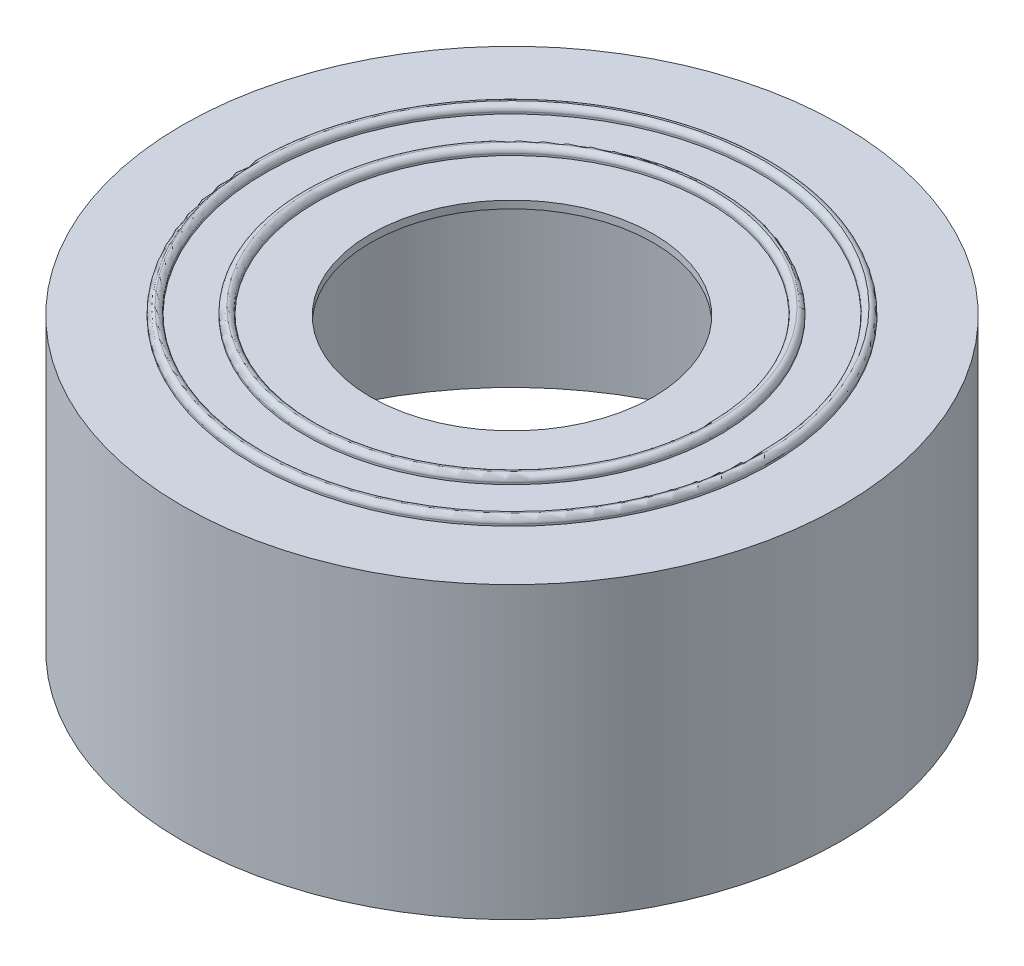
ISO-10303-21;
HEADER;
FILE_DESCRIPTION(('STEP AP214'),'2;1');
FILE_NAME('part.step','',(''),(''),'','','');
FILE_SCHEMA(('AUTOMOTIVE_DESIGN { 1 0 10303 214 1 1 1 1 }'));
ENDSEC;
DATA;
#1=APPLICATION_CONTEXT('core data for automotive mechanical design processes');
#2=APPLICATION_PROTOCOL_DEFINITION('international standard','automotive_design',2000,#1);
#3=PRODUCT_CONTEXT('',#1,'mechanical');
#4=PRODUCT('Part','Part','',(#3));
#5=PRODUCT_RELATED_PRODUCT_CATEGORY('part','',(#4));
#6=PRODUCT_DEFINITION_FORMATION('','',#4);
#7=PRODUCT_DEFINITION_CONTEXT('part definition',#1,'design');
#8=PRODUCT_DEFINITION('design','',#6,#7);
#9=PRODUCT_DEFINITION_SHAPE('','',#8);
#10=(LENGTH_UNIT() NAMED_UNIT(*) SI_UNIT(.MILLI.,.METRE.));
#11=(NAMED_UNIT(*) PLANE_ANGLE_UNIT() SI_UNIT($,.RADIAN.));
#12=(NAMED_UNIT(*) SI_UNIT($,.STERADIAN.) SOLID_ANGLE_UNIT());
#13=UNCERTAINTY_MEASURE_WITH_UNIT(LENGTH_MEASURE(1.E-05),#10,'distance_accuracy_value','');
#14=(GEOMETRIC_REPRESENTATION_CONTEXT(3) GLOBAL_UNCERTAINTY_ASSIGNED_CONTEXT((#13)) GLOBAL_UNIT_ASSIGNED_CONTEXT((#10,
#11,#12)) REPRESENTATION_CONTEXT('',''));
#15=CARTESIAN_POINT('',(0.,0.,0.));
#16=DIRECTION('',(0.,0.,1.));
#17=DIRECTION('',(1.,0.,0.));
#18=AXIS2_PLACEMENT_3D('',#15,#16,#17);
#19=CARTESIAN_POINT('',(0.,-2.,0.));
#20=DIRECTION('',(0.,-1.,0.));
#21=DIRECTION('',(0.,0.,-1.));
#22=AXIS2_PLACEMENT_3D('',#19,#20,#21);
#23=PLANE('',#22);
#24=CARTESIAN_POINT('',(0.,-2.,0.));
#25=DIRECTION('',(0.,-1.,0.));
#26=DIRECTION('',(0.,0.,-1.));
#27=AXIS2_PLACEMENT_3D('',#24,#25,#26);
#28=CIRCLE('',#27,37.5);
#29=CARTESIAN_POINT('',(0.,-2.,-37.5));
#30=VERTEX_POINT('',#29);
#31=EDGE_CURVE('E142',#30,#30,#28,.T.);
#32=ORIENTED_EDGE('',*,*,#31,.F.);
#33=EDGE_LOOP('',(#32));
#34=FACE_BOUND('',#33,.T.);
#35=CARTESIAN_POINT('',(0.,-2.,0.));
#36=DIRECTION('',(0.,-1.,0.));
#37=DIRECTION('',(0.,0.,-1.));
#38=AXIS2_PLACEMENT_3D('',#35,#36,#37);
#39=CIRCLE('',#38,85.5);
#40=CARTESIAN_POINT('',(0.,-2.,-85.5));
#41=VERTEX_POINT('',#40);
#42=EDGE_CURVE('E125',#41,#41,#39,.F.);
#43=ORIENTED_EDGE('',*,*,#42,.F.);
#44=EDGE_LOOP('',(#43));
#45=FACE_BOUND('',#44,.T.);
#46=ADVANCED_FACE('F41',(#34,#45),#23,.T.);
#47=CARTESIAN_POINT('',(0.,0.,0.));
#48=DIRECTION('',(0.,-1.,0.));
#49=DIRECTION('',(0.,0.,-1.));
#50=AXIS2_PLACEMENT_3D('',#47,#48,#49);
#51=PLANE('',#50);
#52=CARTESIAN_POINT('',(0.,0.,0.));
#53=DIRECTION('',(0.,-1.,0.));
#54=DIRECTION('',(0.,0.,-1.));
#55=AXIS2_PLACEMENT_3D('',#52,#53,#54);
#56=CIRCLE('',#55,37.5);
#57=CARTESIAN_POINT('',(0.,0.,-37.5));
#58=VERTEX_POINT('',#57);
#59=EDGE_CURVE('E143',#58,#58,#56,.T.);
#60=ORIENTED_EDGE('',*,*,#59,.T.);
#61=EDGE_LOOP('',(#60));
#62=FACE_BOUND('',#61,.T.);
#63=CARTESIAN_POINT('',(0.,0.,0.));
#64=DIRECTION('',(0.,1.,0.));
#65=DIRECTION('',(0.,0.,1.));
#66=AXIS2_PLACEMENT_3D('',#63,#64,#65);
#67=CIRCLE('',#66,52.);
#68=CARTESIAN_POINT('',(0.,0.,52.));
#69=VERTEX_POINT('',#68);
#70=EDGE_CURVE('E146',#69,#69,#67,.T.);
#71=ORIENTED_EDGE('',*,*,#70,.T.);
#72=EDGE_LOOP('',(#71));
#73=FACE_BOUND('',#72,.T.);
#74=ADVANCED_FACE('F81',(#62,#73),#51,.F.);
#75=CARTESIAN_POINT('',(0.,2.,0.));
#76=DIRECTION('',(0.,-1.,0.));
#77=DIRECTION('',(0.,0.,-1.));
#78=AXIS2_PLACEMENT_3D('',#75,#76,#77);
#79=CYLINDRICAL_SURFACE('',#78,65.5);
#80=CARTESIAN_POINT('',(0.,0.5,0.));
#81=DIRECTION('',(0.,1.,0.));
#82=DIRECTION('',(0.,0.,1.));
#83=AXIS2_PLACEMENT_3D('',#80,#81,#82);
#84=CIRCLE('',#83,65.5);
#85=CARTESIAN_POINT('',(0.,0.5,65.5));
#86=VERTEX_POINT('',#85);
#87=EDGE_CURVE('E49',#86,#86,#84,.T.);
#88=ORIENTED_EDGE('',*,*,#87,.T.);
#89=EDGE_LOOP('',(#88));
#90=FACE_BOUND('',#89,.T.);
#91=CARTESIAN_POINT('',(0.,0.,0.));
#92=DIRECTION('',(0.,1.,0.));
#93=DIRECTION('',(0.,0.,1.));
#94=AXIS2_PLACEMENT_3D('',#91,#92,#93);
#95=CIRCLE('',#94,65.5);
#96=CARTESIAN_POINT('',(0.,0.,65.5));
#97=VERTEX_POINT('',#96);
#98=EDGE_CURVE('E133',#97,#97,#95,.T.);
#99=ORIENTED_EDGE('',*,*,#98,.F.);
#100=EDGE_LOOP('',(#99));
#101=FACE_BOUND('',#100,.T.);
#102=ADVANCED_FACE('F87',(#90,#101),#79,.F.);
#103=CARTESIAN_POINT('',(0.,2.,0.));
#104=DIRECTION('',(0.,-1.,0.));
#105=DIRECTION('',(0.,0.,-1.));
#106=AXIS2_PLACEMENT_3D('',#103,#104,#105);
#107=CYLINDRICAL_SURFACE('',#106,68.5);
#108=CARTESIAN_POINT('',(0.,0.5,0.));
#109=DIRECTION('',(0.,1.,0.));
#110=DIRECTION('',(0.,0.,1.));
#111=AXIS2_PLACEMENT_3D('',#108,#109,#110);
#112=CIRCLE('',#111,68.5);
#113=CARTESIAN_POINT('',(0.,0.5,68.5));
#114=VERTEX_POINT('',#113);
#115=EDGE_CURVE('E11',#114,#114,#112,.F.);
#116=ORIENTED_EDGE('',*,*,#115,.T.);
#117=EDGE_LOOP('',(#116));
#118=FACE_BOUND('',#117,.T.);
#119=CARTESIAN_POINT('',(0.,0.,0.));
#120=DIRECTION('',(0.,1.,0.));
#121=DIRECTION('',(0.,0.,1.));
#122=AXIS2_PLACEMENT_3D('',#119,#120,#121);
#123=CIRCLE('',#122,68.5);
#124=CARTESIAN_POINT('',(0.,0.,68.5));
#125=VERTEX_POINT('',#124);
#126=EDGE_CURVE('E134',#125,#125,#123,.T.);
#127=ORIENTED_EDGE('',*,*,#126,.T.);
#128=EDGE_LOOP('',(#127));
#129=FACE_BOUND('',#128,.T.);
#130=ADVANCED_FACE('F104',(#118,#129),#107,.T.);
#131=CARTESIAN_POINT('',(0.,0.,0.));
#132=DIRECTION('',(0.,-1.,0.));
#133=DIRECTION('',(0.,0.,-1.));
#134=AXIS2_PLACEMENT_3D('',#131,#132,#133);
#135=CIRCLE('',#134,55.);
#136=CARTESIAN_POINT('',(0.,0.,-55.));
#137=VERTEX_POINT('',#136);
#138=EDGE_CURVE('E130',#137,#137,#135,.F.);
#139=ORIENTED_EDGE('',*,*,#138,.F.);
#140=EDGE_LOOP('',(#139));
#141=FACE_BOUND('',#140,.T.);
#142=ORIENTED_EDGE('',*,*,#98,.T.);
#143=EDGE_LOOP('',(#142));
#144=FACE_BOUND('',#143,.T.);
#145=ADVANCED_FACE('F90',(#141,#144),#51,.F.);
#146=ORIENTED_EDGE('',*,*,#126,.F.);
#147=EDGE_LOOP('',(#146));
#148=FACE_BOUND('',#147,.T.);
#149=CARTESIAN_POINT('',(0.,0.,0.));
#150=DIRECTION('',(0.,-1.,0.));
#151=DIRECTION('',(0.,0.,-1.));
#152=AXIS2_PLACEMENT_3D('',#149,#150,#151);
#153=CIRCLE('',#152,87.5);
#154=CARTESIAN_POINT('',(0.,0.,-87.5));
#155=VERTEX_POINT('',#154);
#156=EDGE_CURVE('E137',#155,#155,#153,.T.);
#157=ORIENTED_EDGE('',*,*,#156,.F.);
#158=EDGE_LOOP('',(#157));
#159=FACE_BOUND('',#158,.T.);
#160=ADVANCED_FACE('F91',(#148,#159),#51,.F.);
#161=CARTESIAN_POINT('',(0.,-2.,0.));
#162=DIRECTION('',(0.,1.,0.));
#163=DIRECTION('',(0.,0.,1.));
#164=AXIS2_PLACEMENT_3D('',#161,#162,#163);
#165=CYLINDRICAL_SURFACE('',#164,87.5);
#166=ORIENTED_EDGE('',*,*,#156,.T.);
#167=EDGE_LOOP('',(#166));
#168=FACE_BOUND('',#167,.T.);
#169=CARTESIAN_POINT('',(0.,-77.,0.));
#170=DIRECTION('',(0.,-1.,0.));
#171=DIRECTION('',(0.,0.,-1.));
#172=AXIS2_PLACEMENT_3D('',#169,#170,#171);
#173=CIRCLE('',#172,87.5);
#174=CARTESIAN_POINT('',(0.,-77.,-87.5));
#175=VERTEX_POINT('',#174);
#176=EDGE_CURVE('E63',#175,#175,#173,.T.);
#177=ORIENTED_EDGE('',*,*,#176,.F.);
#178=EDGE_LOOP('',(#177));
#179=FACE_BOUND('',#178,.T.);
#180=ADVANCED_FACE('F99',(#168,#179),#165,.T.);
#181=CARTESIAN_POINT('',(0.,-2.,0.));
#182=DIRECTION('',(0.,1.,0.));
#183=DIRECTION('',(0.,0.,1.));
#184=AXIS2_PLACEMENT_3D('',#181,#182,#183);
#185=CYLINDRICAL_SURFACE('',#184,37.5);
#186=ORIENTED_EDGE('',*,*,#31,.T.);
#187=EDGE_LOOP('',(#186));
#188=FACE_BOUND('',#187,.T.);
#189=ORIENTED_EDGE('',*,*,#59,.F.);
#190=EDGE_LOOP('',(#189));
#191=FACE_BOUND('',#190,.T.);
#192=ADVANCED_FACE('F95',(#188,#191),#185,.F.);
#193=CARTESIAN_POINT('',(0.,2.,0.));
#194=DIRECTION('',(0.,-1.,0.));
#195=DIRECTION('',(0.,0.,-1.));
#196=AXIS2_PLACEMENT_3D('',#193,#194,#195);
#197=CYLINDRICAL_SURFACE('',#196,52.);
#198=CARTESIAN_POINT('',(0.,0.5,0.));
#199=DIRECTION('',(0.,1.,0.));
#200=DIRECTION('',(0.,0.,1.));
#201=AXIS2_PLACEMENT_3D('',#198,#199,#200);
#202=CIRCLE('',#201,52.);
#203=CARTESIAN_POINT('',(0.,0.5,52.));
#204=VERTEX_POINT('',#203);
#205=EDGE_CURVE('E123',#204,#204,#202,.T.);
#206=ORIENTED_EDGE('',*,*,#205,.T.);
#207=EDGE_LOOP('',(#206));
#208=FACE_BOUND('',#207,.T.);
#209=ORIENTED_EDGE('',*,*,#70,.F.);
#210=EDGE_LOOP('',(#209));
#211=FACE_BOUND('',#210,.T.);
#212=ADVANCED_FACE('F165',(#208,#211),#197,.F.);
#213=CARTESIAN_POINT('',(0.,2.,0.));
#214=DIRECTION('',(0.,-1.,0.));
#215=DIRECTION('',(0.,0.,-1.));
#216=AXIS2_PLACEMENT_3D('',#213,#214,#215);
#217=CYLINDRICAL_SURFACE('',#216,55.);
#218=CARTESIAN_POINT('',(0.,0.5,0.));
#219=DIRECTION('',(0.,1.,0.));
#220=DIRECTION('',(0.,0.,1.));
#221=AXIS2_PLACEMENT_3D('',#218,#219,#220);
#222=CIRCLE('',#221,55.);
#223=CARTESIAN_POINT('',(0.,0.5,55.));
#224=VERTEX_POINT('',#223);
#225=EDGE_CURVE('E54',#224,#224,#222,.F.);
#226=ORIENTED_EDGE('',*,*,#225,.T.);
#227=EDGE_LOOP('',(#226));
#228=FACE_BOUND('',#227,.T.);
#229=ORIENTED_EDGE('',*,*,#138,.T.);
#230=EDGE_LOOP('',(#229));
#231=FACE_BOUND('',#230,.T.);
#232=ADVANCED_FACE('F157',(#228,#231),#217,.T.);
#233=CARTESIAN_POINT('',(0.,-77.,0.));
#234=DIRECTION('',(0.,-1.,0.));
#235=DIRECTION('',(0.,0.,-1.));
#236=AXIS2_PLACEMENT_3D('',#233,#234,#235);
#237=PLANE('',#236);
#238=ORIENTED_EDGE('',*,*,#176,.T.);
#239=EDGE_LOOP('',(#238));
#240=FACE_BOUND('',#239,.T.);
#241=CARTESIAN_POINT('',(0.,-77.,0.));
#242=DIRECTION('',(0.,-1.,0.));
#243=DIRECTION('',(0.,0.,-1.));
#244=AXIS2_PLACEMENT_3D('',#241,#242,#243);
#245=CIRCLE('',#244,85.5);
#246=CARTESIAN_POINT('',(0.,-77.,-85.5));
#247=VERTEX_POINT('',#246);
#248=EDGE_CURVE('E59',#247,#247,#245,.T.);
#249=ORIENTED_EDGE('',*,*,#248,.F.);
#250=EDGE_LOOP('',(#249));
#251=FACE_BOUND('',#250,.T.);
#252=ADVANCED_FACE('F116',(#240,#251),#237,.T.);
#253=CARTESIAN_POINT('',(0.,-77.,0.));
#254=DIRECTION('',(0.,1.,0.));
#255=DIRECTION('',(0.,0.,1.));
#256=AXIS2_PLACEMENT_3D('',#253,#254,#255);
#257=CYLINDRICAL_SURFACE('',#256,85.5);
#258=ORIENTED_EDGE('',*,*,#248,.T.);
#259=EDGE_LOOP('',(#258));
#260=FACE_BOUND('',#259,.T.);
#261=ORIENTED_EDGE('',*,*,#42,.T.);
#262=EDGE_LOOP('',(#261));
#263=FACE_BOUND('',#262,.T.);
#264=ADVANCED_FACE('F111',(#260,#263),#257,.F.);
#265=CARTESIAN_POINT('',(0.,0.5,0.));
#266=DIRECTION('',(0.,1.,0.));
#267=DIRECTION('',(0.,0.,1.));
#268=AXIS2_PLACEMENT_3D('',#265,#266,#267);
#269=TOROIDAL_SURFACE('',#268,53.5,1.5);
#270=ORIENTED_EDGE('',*,*,#225,.F.);
#271=EDGE_LOOP('',(#270));
#272=FACE_BOUND('',#271,.T.);
#273=CARTESIAN_POINT('',(0.,2.,0.));
#274=DIRECTION('',(0.,1.,0.));
#275=DIRECTION('',(0.,0.,1.));
#276=AXIS2_PLACEMENT_3D('',#273,#274,#275);
#277=CIRCLE('',#276,53.5);
#278=CARTESIAN_POINT('',(0.,2.,53.5));
#279=VERTEX_POINT('',#278);
#280=EDGE_CURVE('E57',#279,#279,#277,.T.);
#281=ORIENTED_EDGE('',*,*,#280,.F.);
#282=EDGE_LOOP('',(#281));
#283=FACE_BOUND('',#282,.T.);
#284=ADVANCED_FACE('F78',(#272,#283),#269,.T.);
#285=CARTESIAN_POINT('',(0.,0.5,0.));
#286=DIRECTION('',(0.,1.,0.));
#287=DIRECTION('',(0.,0.,1.));
#288=AXIS2_PLACEMENT_3D('',#285,#286,#287);
#289=TOROIDAL_SURFACE('',#288,53.5,1.5);
#290=ORIENTED_EDGE('',*,*,#280,.T.);
#291=EDGE_LOOP('',(#290));
#292=FACE_BOUND('',#291,.T.);
#293=ORIENTED_EDGE('',*,*,#205,.F.);
#294=EDGE_LOOP('',(#293));
#295=FACE_BOUND('',#294,.T.);
#296=ADVANCED_FACE('F72',(#292,#295),#289,.T.);
#297=CARTESIAN_POINT('',(0.,0.5,0.));
#298=DIRECTION('',(0.,1.,0.));
#299=DIRECTION('',(0.,0.,1.));
#300=AXIS2_PLACEMENT_3D('',#297,#298,#299);
#301=TOROIDAL_SURFACE('',#300,67.,1.5);
#302=ORIENTED_EDGE('',*,*,#115,.F.);
#303=EDGE_LOOP('',(#302));
#304=FACE_BOUND('',#303,.T.);
#305=CARTESIAN_POINT('',(0.,2.,0.));
#306=DIRECTION('',(0.,1.,0.));
#307=DIRECTION('',(0.,0.,1.));
#308=AXIS2_PLACEMENT_3D('',#305,#306,#307);
#309=CIRCLE('',#308,67.);
#310=CARTESIAN_POINT('',(0.,2.,67.));
#311=VERTEX_POINT('',#310);
#312=EDGE_CURVE('E45',#311,#311,#309,.T.);
#313=ORIENTED_EDGE('',*,*,#312,.F.);
#314=EDGE_LOOP('',(#313));
#315=FACE_BOUND('',#314,.T.);
#316=ADVANCED_FACE('F43',(#304,#315),#301,.T.);
#317=CARTESIAN_POINT('',(0.,0.5,0.));
#318=DIRECTION('',(0.,1.,0.));
#319=DIRECTION('',(0.,0.,1.));
#320=AXIS2_PLACEMENT_3D('',#317,#318,#319);
#321=TOROIDAL_SURFACE('',#320,67.,1.5);
#322=ORIENTED_EDGE('',*,*,#312,.T.);
#323=EDGE_LOOP('',(#322));
#324=FACE_BOUND('',#323,.T.);
#325=ORIENTED_EDGE('',*,*,#87,.F.);
#326=EDGE_LOOP('',(#325));
#327=FACE_BOUND('',#326,.T.);
#328=ADVANCED_FACE('F68',(#324,#327),#321,.T.);
#329=CLOSED_SHELL('',(#46,#74,#102,#130,#145,#160,#180,#192,#212,#232,#252,#264,#284,#296,#316,#328));
#330=MANIFOLD_SOLID_BREP('B2',#329);
#331=ADVANCED_BREP_SHAPE_REPRESENTATION('',(#18,#330),#14);
#332=SHAPE_DEFINITION_REPRESENTATION(#9,#331);
ENDSEC;
END-ISO-10303-21;
